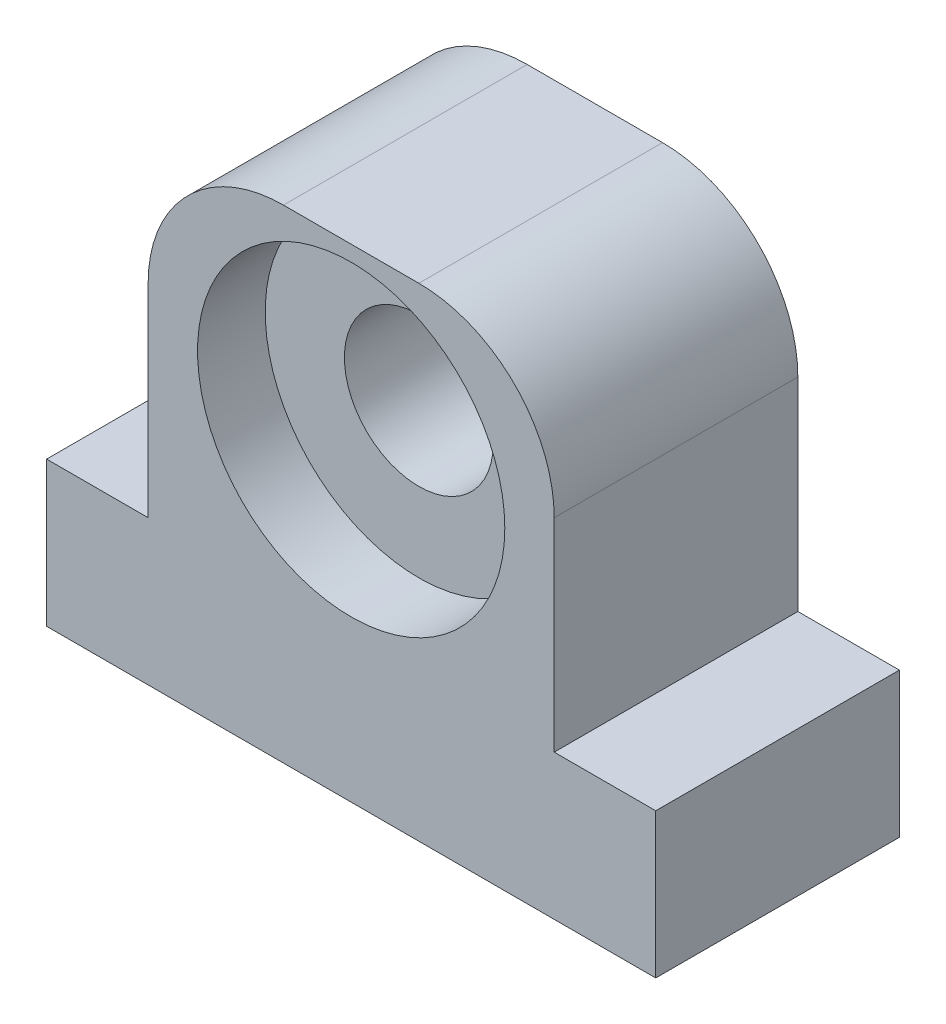
ISO-10303-21;
HEADER;
FILE_DESCRIPTION(('STEP AP214'),'2;1');
FILE_NAME('part.step','',(''),(''),'','','');
FILE_SCHEMA(('AUTOMOTIVE_DESIGN { 1 0 10303 214 1 1 1 1 }'));
ENDSEC;
DATA;
#1=APPLICATION_CONTEXT('core data for automotive mechanical design processes');
#2=APPLICATION_PROTOCOL_DEFINITION('international standard','automotive_design',2000,#1);
#3=PRODUCT_CONTEXT('',#1,'mechanical');
#4=PRODUCT('Part','Part','',(#3));
#5=PRODUCT_RELATED_PRODUCT_CATEGORY('part','',(#4));
#6=PRODUCT_DEFINITION_FORMATION('','',#4);
#7=PRODUCT_DEFINITION_CONTEXT('part definition',#1,'design');
#8=PRODUCT_DEFINITION('design','',#6,#7);
#9=PRODUCT_DEFINITION_SHAPE('','',#8);
#10=(LENGTH_UNIT() NAMED_UNIT(*) SI_UNIT(.MILLI.,.METRE.));
#11=(NAMED_UNIT(*) PLANE_ANGLE_UNIT() SI_UNIT($,.RADIAN.));
#12=(NAMED_UNIT(*) SI_UNIT($,.STERADIAN.) SOLID_ANGLE_UNIT());
#13=UNCERTAINTY_MEASURE_WITH_UNIT(LENGTH_MEASURE(1.E-05),#10,'distance_accuracy_value','');
#14=(GEOMETRIC_REPRESENTATION_CONTEXT(3) GLOBAL_UNCERTAINTY_ASSIGNED_CONTEXT((#13)) GLOBAL_UNIT_ASSIGNED_CONTEXT((#10,
#11,#12)) REPRESENTATION_CONTEXT('',''));
#15=CARTESIAN_POINT('',(0.,0.,0.));
#16=DIRECTION('',(0.,0.,1.));
#17=DIRECTION('',(1.,0.,0.));
#18=AXIS2_PLACEMENT_3D('',#15,#16,#17);
#19=CARTESIAN_POINT('',(0.,15.5,-16.));
#20=DIRECTION('',(0.,0.,1.));
#21=DIRECTION('',(1.,0.,0.));
#22=AXIS2_PLACEMENT_3D('',#19,#20,#21);
#23=CYLINDRICAL_SURFACE('',#22,5.5);
#24=CARTESIAN_POINT('',(0.,15.5,-9.));
#25=DIRECTION('',(0.,0.,1.));
#26=DIRECTION('',(1.,0.,0.));
#27=AXIS2_PLACEMENT_3D('',#24,#25,#26);
#28=CIRCLE('',#27,5.5);
#29=CARTESIAN_POINT('',(5.5,15.5,-9.));
#30=VERTEX_POINT('',#29);
#31=EDGE_CURVE('E160',#30,#30,#28,.T.);
#32=ORIENTED_EDGE('',*,*,#31,.F.);
#33=EDGE_LOOP('',(#32));
#34=FACE_BOUND('',#33,.T.);
#35=CARTESIAN_POINT('',(0.,15.5,4.));
#36=DIRECTION('',(0.,0.,1.));
#37=DIRECTION('',(1.,0.,0.));
#38=AXIS2_PLACEMENT_3D('',#35,#36,#37);
#39=CIRCLE('',#38,5.5);
#40=CARTESIAN_POINT('',(5.5,15.5,4.));
#41=VERTEX_POINT('',#40);
#42=EDGE_CURVE('E156',#41,#41,#39,.F.);
#43=ORIENTED_EDGE('',*,*,#42,.F.);
#44=EDGE_LOOP('',(#43));
#45=FACE_BOUND('',#44,.T.);
#46=ADVANCED_FACE('F39',(#34,#45),#23,.F.);
#47=CARTESIAN_POINT('',(0.,3.,0.));
#48=DIRECTION('',(0.,1.,0.));
#49=DIRECTION('',(0.,0.,1.));
#50=AXIS2_PLACEMENT_3D('',#47,#48,#49);
#51=PLANE('',#50);
#52=DIRECTION('',(0.,0.,-1.));
#53=VECTOR('',#52,1.);
#54=CARTESIAN_POINT('',(15.,3.,-9.));
#55=LINE('',#54,#53);
#56=CARTESIAN_POINT('',(15.,3.,9.));
#57=VERTEX_POINT('',#56);
#58=CARTESIAN_POINT('',(15.,3.,-9.));
#59=VERTEX_POINT('',#58);
#60=EDGE_CURVE('E164',#57,#59,#55,.T.);
#61=ORIENTED_EDGE('',*,*,#60,.F.);
#62=DIRECTION('',(1.,0.,0.));
#63=VECTOR('',#62,1.);
#64=CARTESIAN_POINT('',(-22.5,3.,9.));
#65=LINE('',#64,#63);
#66=CARTESIAN_POINT('',(22.5,3.,9.));
#67=VERTEX_POINT('',#66);
#68=EDGE_CURVE('E203',#57,#67,#65,.T.);
#69=ORIENTED_EDGE('',*,*,#68,.T.);
#70=DIRECTION('',(0.,0.,-1.));
#71=VECTOR('',#70,1.);
#72=CARTESIAN_POINT('',(22.5,3.,-9.));
#73=LINE('',#72,#71);
#74=CARTESIAN_POINT('',(22.5,3.,-9.));
#75=VERTEX_POINT('',#74);
#76=EDGE_CURVE('E192',#67,#75,#73,.T.);
#77=ORIENTED_EDGE('',*,*,#76,.T.);
#78=DIRECTION('',(-1.,0.,0.));
#79=VECTOR('',#78,1.);
#80=CARTESIAN_POINT('',(-22.5,3.,-9.));
#81=LINE('',#80,#79);
#82=EDGE_CURVE('E197',#75,#59,#81,.T.);
#83=ORIENTED_EDGE('',*,*,#82,.T.);
#84=EDGE_LOOP('',(#61,#69,#77,#83));
#85=FACE_BOUND('',#84,.T.);
#86=ADVANCED_FACE('F257',(#85),#51,.T.);
#87=CARTESIAN_POINT('',(22.5,3.,-9.));
#88=DIRECTION('',(-1.,0.,0.));
#89=DIRECTION('',(0.,0.,1.));
#90=AXIS2_PLACEMENT_3D('',#87,#88,#89);
#91=PLANE('',#90);
#92=DIRECTION('',(0.,-1.,0.));
#93=VECTOR('',#92,1.);
#94=CARTESIAN_POINT('',(22.5,3.,9.));
#95=LINE('',#94,#93);
#96=CARTESIAN_POINT('',(22.5,-7.7,9.));
#97=VERTEX_POINT('',#96);
#98=EDGE_CURVE('E208',#67,#97,#95,.T.);
#99=ORIENTED_EDGE('',*,*,#98,.T.);
#100=DIRECTION('',(0.,0.,1.));
#101=VECTOR('',#100,1.);
#102=CARTESIAN_POINT('',(22.5,-7.7,9.));
#103=LINE('',#102,#101);
#104=CARTESIAN_POINT('',(22.5,-7.7,-9.));
#105=VERTEX_POINT('',#104);
#106=EDGE_CURVE('E138',#105,#97,#103,.T.);
#107=ORIENTED_EDGE('',*,*,#106,.F.);
#108=DIRECTION('',(0.,-1.,0.));
#109=VECTOR('',#108,1.);
#110=CARTESIAN_POINT('',(22.5,3.,-9.));
#111=LINE('',#110,#109);
#112=EDGE_CURVE('E127',#75,#105,#111,.T.);
#113=ORIENTED_EDGE('',*,*,#112,.F.);
#114=ORIENTED_EDGE('',*,*,#76,.F.);
#115=EDGE_LOOP('',(#99,#107,#113,#114));
#116=FACE_BOUND('',#115,.T.);
#117=ADVANCED_FACE('F261',(#116),#91,.F.);
#118=CARTESIAN_POINT('',(-22.5,3.,-9.));
#119=DIRECTION('',(0.,0.,1.));
#120=DIRECTION('',(1.,0.,0.));
#121=AXIS2_PLACEMENT_3D('',#118,#119,#120);
#122=PLANE('',#121);
#123=ORIENTED_EDGE('',*,*,#31,.T.);
#124=EDGE_LOOP('',(#123));
#125=FACE_BOUND('',#124,.T.);
#126=DIRECTION('',(0.,-1.,0.));
#127=VECTOR('',#126,1.);
#128=CARTESIAN_POINT('',(-15.,28.,-9.));
#129=LINE('',#128,#127);
#130=CARTESIAN_POINT('',(-15.,18.,-9.));
#131=VERTEX_POINT('',#130);
#132=CARTESIAN_POINT('',(-15.,3.,-9.));
#133=VERTEX_POINT('',#132);
#134=EDGE_CURVE('E186',#131,#133,#129,.T.);
#135=ORIENTED_EDGE('',*,*,#134,.F.);
#136=CARTESIAN_POINT('',(-5.,18.,-9.));
#137=DIRECTION('',(0.,0.,1.));
#138=DIRECTION('',(1.,0.,0.));
#139=AXIS2_PLACEMENT_3D('',#136,#137,#138);
#140=CIRCLE('',#139,10.);
#141=CARTESIAN_POINT('',(-5.,28.,-9.));
#142=VERTEX_POINT('',#141);
#143=EDGE_CURVE('E48',#131,#142,#140,.F.);
#144=ORIENTED_EDGE('',*,*,#143,.T.);
#145=DIRECTION('',(-1.,0.,0.));
#146=VECTOR('',#145,1.);
#147=CARTESIAN_POINT('',(-15.,28.,-9.));
#148=LINE('',#147,#146);
#149=CARTESIAN_POINT('',(5.,28.,-9.));
#150=VERTEX_POINT('',#149);
#151=EDGE_CURVE('E165',#150,#142,#148,.T.);
#152=ORIENTED_EDGE('',*,*,#151,.F.);
#153=CARTESIAN_POINT('',(5.,18.,-9.));
#154=DIRECTION('',(0.,0.,1.));
#155=DIRECTION('',(1.,0.,0.));
#156=AXIS2_PLACEMENT_3D('',#153,#154,#155);
#157=CIRCLE('',#156,10.);
#158=CARTESIAN_POINT('',(15.,18.,-9.));
#159=VERTEX_POINT('',#158);
#160=EDGE_CURVE('E55',#150,#159,#157,.F.);
#161=ORIENTED_EDGE('',*,*,#160,.T.);
#162=DIRECTION('',(0.,-1.,0.));
#163=VECTOR('',#162,1.);
#164=CARTESIAN_POINT('',(15.,28.,-9.));
#165=LINE('',#164,#163);
#166=EDGE_CURVE('E189',#159,#59,#165,.T.);
#167=ORIENTED_EDGE('',*,*,#166,.T.);
#168=ORIENTED_EDGE('',*,*,#82,.F.);
#169=ORIENTED_EDGE('',*,*,#112,.T.);
#170=DIRECTION('',(1.,0.,0.));
#171=VECTOR('',#170,1.);
#172=CARTESIAN_POINT('',(-22.5,-7.7,-9.));
#173=LINE('',#172,#171);
#174=CARTESIAN_POINT('',(-22.5,-7.7,-9.));
#175=VERTEX_POINT('',#174);
#176=EDGE_CURVE('E131',#175,#105,#173,.T.);
#177=ORIENTED_EDGE('',*,*,#176,.F.);
#178=DIRECTION('',(0.,-1.,0.));
#179=VECTOR('',#178,1.);
#180=CARTESIAN_POINT('',(-22.5,3.,-9.));
#181=LINE('',#180,#179);
#182=CARTESIAN_POINT('',(-22.5,3.,-9.));
#183=VERTEX_POINT('',#182);
#184=EDGE_CURVE('E118',#183,#175,#181,.T.);
#185=ORIENTED_EDGE('',*,*,#184,.F.);
#186=EDGE_CURVE('E196',#133,#183,#81,.T.);
#187=ORIENTED_EDGE('',*,*,#186,.F.);
#188=EDGE_LOOP('',(#135,#144,#152,#161,#167,#168,#169,#177,#185,#187));
#189=FACE_BOUND('',#188,.T.);
#190=ADVANCED_FACE('F132',(#125,#189),#122,.F.);
#191=CARTESIAN_POINT('',(-22.5,3.,-9.));
#192=DIRECTION('',(1.,0.,0.));
#193=DIRECTION('',(0.,0.,-1.));
#194=AXIS2_PLACEMENT_3D('',#191,#192,#193);
#195=PLANE('',#194);
#196=ORIENTED_EDGE('',*,*,#184,.T.);
#197=DIRECTION('',(0.,0.,-1.));
#198=VECTOR('',#197,1.);
#199=CARTESIAN_POINT('',(-22.5,-7.7,9.));
#200=LINE('',#199,#198);
#201=CARTESIAN_POINT('',(-22.5,-7.7,9.));
#202=VERTEX_POINT('',#201);
#203=EDGE_CURVE('E123',#202,#175,#200,.T.);
#204=ORIENTED_EDGE('',*,*,#203,.F.);
#205=DIRECTION('',(0.,-1.,0.));
#206=VECTOR('',#205,1.);
#207=CARTESIAN_POINT('',(-22.5,3.,9.));
#208=LINE('',#207,#206);
#209=CARTESIAN_POINT('',(-22.5,3.,9.));
#210=VERTEX_POINT('',#209);
#211=EDGE_CURVE('E128',#210,#202,#208,.T.);
#212=ORIENTED_EDGE('',*,*,#211,.F.);
#213=DIRECTION('',(0.,0.,1.));
#214=VECTOR('',#213,1.);
#215=CARTESIAN_POINT('',(-22.5,3.,-9.));
#216=LINE('',#215,#214);
#217=EDGE_CURVE('E124',#183,#210,#216,.T.);
#218=ORIENTED_EDGE('',*,*,#217,.F.);
#219=EDGE_LOOP('',(#196,#204,#212,#218));
#220=FACE_BOUND('',#219,.T.);
#221=ADVANCED_FACE('F120',(#220),#195,.F.);
#222=CARTESIAN_POINT('',(-22.5,3.,9.));
#223=DIRECTION('',(0.,0.,-1.));
#224=DIRECTION('',(-1.,0.,0.));
#225=AXIS2_PLACEMENT_3D('',#222,#223,#224);
#226=PLANE('',#225);
#227=CARTESIAN_POINT('',(0.,15.5,9.));
#228=DIRECTION('',(0.,0.,1.));
#229=DIRECTION('',(1.,0.,0.));
#230=AXIS2_PLACEMENT_3D('',#227,#228,#229);
#231=CIRCLE('',#230,11.35);
#232=CARTESIAN_POINT('',(11.35,15.5,9.));
#233=VERTEX_POINT('',#232);
#234=EDGE_CURVE('E151',#233,#233,#231,.T.);
#235=ORIENTED_EDGE('',*,*,#234,.F.);
#236=EDGE_LOOP('',(#235));
#237=FACE_BOUND('',#236,.T.);
#238=DIRECTION('',(1.,0.,0.));
#239=VECTOR('',#238,1.);
#240=CARTESIAN_POINT('',(-15.,28.,9.));
#241=LINE('',#240,#239);
#242=CARTESIAN_POINT('',(-5.,28.,9.));
#243=VERTEX_POINT('',#242);
#244=CARTESIAN_POINT('',(5.,28.,9.));
#245=VERTEX_POINT('',#244);
#246=EDGE_CURVE('E169',#243,#245,#241,.T.);
#247=ORIENTED_EDGE('',*,*,#246,.F.);
#248=CARTESIAN_POINT('',(-5.,18.,9.));
#249=DIRECTION('',(0.,0.,-1.));
#250=DIRECTION('',(-1.,0.,0.));
#251=AXIS2_PLACEMENT_3D('',#248,#249,#250);
#252=CIRCLE('',#251,10.);
#253=CARTESIAN_POINT('',(-15.,18.,9.));
#254=VERTEX_POINT('',#253);
#255=EDGE_CURVE('E229',#243,#254,#252,.F.);
#256=ORIENTED_EDGE('',*,*,#255,.T.);
#257=DIRECTION('',(0.,-1.,0.));
#258=VECTOR('',#257,1.);
#259=CARTESIAN_POINT('',(-15.,28.,9.));
#260=LINE('',#259,#258);
#261=CARTESIAN_POINT('',(-15.,3.,9.));
#262=VERTEX_POINT('',#261);
#263=EDGE_CURVE('E183',#254,#262,#260,.T.);
#264=ORIENTED_EDGE('',*,*,#263,.T.);
#265=EDGE_CURVE('E204',#210,#262,#65,.T.);
#266=ORIENTED_EDGE('',*,*,#265,.F.);
#267=ORIENTED_EDGE('',*,*,#211,.T.);
#268=DIRECTION('',(-1.,0.,0.));
#269=VECTOR('',#268,1.);
#270=CARTESIAN_POINT('',(-22.5,-7.7,9.));
#271=LINE('',#270,#269);
#272=EDGE_CURVE('E143',#97,#202,#271,.T.);
#273=ORIENTED_EDGE('',*,*,#272,.F.);
#274=ORIENTED_EDGE('',*,*,#98,.F.);
#275=ORIENTED_EDGE('',*,*,#68,.F.);
#276=DIRECTION('',(0.,-1.,0.));
#277=VECTOR('',#276,1.);
#278=CARTESIAN_POINT('',(15.,28.,9.));
#279=LINE('',#278,#277);
#280=CARTESIAN_POINT('',(15.,18.,9.));
#281=VERTEX_POINT('',#280);
#282=EDGE_CURVE('E174',#281,#57,#279,.T.);
#283=ORIENTED_EDGE('',*,*,#282,.F.);
#284=CARTESIAN_POINT('',(5.,18.,9.));
#285=DIRECTION('',(0.,0.,-1.));
#286=DIRECTION('',(-1.,0.,0.));
#287=AXIS2_PLACEMENT_3D('',#284,#285,#286);
#288=CIRCLE('',#287,10.);
#289=EDGE_CURVE('E226',#281,#245,#288,.F.);
#290=ORIENTED_EDGE('',*,*,#289,.T.);
#291=EDGE_LOOP('',(#247,#256,#264,#266,#267,#273,#274,#275,#283,#290));
#292=FACE_BOUND('',#291,.T.);
#293=ADVANCED_FACE('F245',(#237,#292),#226,.F.);
#294=DIRECTION('',(0.,0.,1.));
#295=VECTOR('',#294,1.);
#296=CARTESIAN_POINT('',(-15.,3.,-9.));
#297=LINE('',#296,#295);
#298=EDGE_CURVE('E170',#133,#262,#297,.T.);
#299=ORIENTED_EDGE('',*,*,#298,.F.);
#300=ORIENTED_EDGE('',*,*,#186,.T.);
#301=ORIENTED_EDGE('',*,*,#217,.T.);
#302=ORIENTED_EDGE('',*,*,#265,.T.);
#303=EDGE_LOOP('',(#299,#300,#301,#302));
#304=FACE_BOUND('',#303,.T.);
#305=ADVANCED_FACE('F250',(#304),#51,.T.);
#306=CARTESIAN_POINT('',(15.,28.,-9.));
#307=DIRECTION('',(-1.,0.,0.));
#308=DIRECTION('',(0.,0.,1.));
#309=AXIS2_PLACEMENT_3D('',#306,#307,#308);
#310=PLANE('',#309);
#311=ORIENTED_EDGE('',*,*,#166,.F.);
#312=DIRECTION('',(0.,0.,-1.));
#313=VECTOR('',#312,1.);
#314=CARTESIAN_POINT('',(15.,18.,9.));
#315=LINE('',#314,#313);
#316=EDGE_CURVE('E11',#159,#281,#315,.F.);
#317=ORIENTED_EDGE('',*,*,#316,.T.);
#318=ORIENTED_EDGE('',*,*,#282,.T.);
#319=ORIENTED_EDGE('',*,*,#60,.T.);
#320=EDGE_LOOP('',(#311,#317,#318,#319));
#321=FACE_BOUND('',#320,.T.);
#322=ADVANCED_FACE('F287',(#321),#310,.F.);
#323=CARTESIAN_POINT('',(-15.,28.,-9.));
#324=DIRECTION('',(1.,0.,0.));
#325=DIRECTION('',(0.,0.,-1.));
#326=AXIS2_PLACEMENT_3D('',#323,#324,#325);
#327=PLANE('',#326);
#328=ORIENTED_EDGE('',*,*,#263,.F.);
#329=DIRECTION('',(0.,0.,1.));
#330=VECTOR('',#329,1.);
#331=CARTESIAN_POINT('',(-15.,18.,-9.));
#332=LINE('',#331,#330);
#333=EDGE_CURVE('E63',#254,#131,#332,.F.);
#334=ORIENTED_EDGE('',*,*,#333,.T.);
#335=ORIENTED_EDGE('',*,*,#134,.T.);
#336=ORIENTED_EDGE('',*,*,#298,.T.);
#337=EDGE_LOOP('',(#328,#334,#335,#336));
#338=FACE_BOUND('',#337,.T.);
#339=ADVANCED_FACE('F247',(#338),#327,.F.);
#340=CARTESIAN_POINT('',(0.,28.,0.));
#341=DIRECTION('',(0.,1.,0.));
#342=DIRECTION('',(0.,0.,1.));
#343=AXIS2_PLACEMENT_3D('',#340,#341,#342);
#344=PLANE('',#343);
#345=ORIENTED_EDGE('',*,*,#151,.T.);
#346=DIRECTION('',(0.,0.,1.));
#347=VECTOR('',#346,1.);
#348=CARTESIAN_POINT('',(-5.,28.,9.));
#349=LINE('',#348,#347);
#350=EDGE_CURVE('E222',#142,#243,#349,.T.);
#351=ORIENTED_EDGE('',*,*,#350,.T.);
#352=ORIENTED_EDGE('',*,*,#246,.T.);
#353=DIRECTION('',(0.,0.,-1.));
#354=VECTOR('',#353,1.);
#355=CARTESIAN_POINT('',(5.,28.,-9.));
#356=LINE('',#355,#354);
#357=EDGE_CURVE('E215',#245,#150,#356,.T.);
#358=ORIENTED_EDGE('',*,*,#357,.T.);
#359=EDGE_LOOP('',(#345,#351,#352,#358));
#360=FACE_BOUND('',#359,.T.);
#361=ADVANCED_FACE('F240',(#360),#344,.T.);
#362=CARTESIAN_POINT('',(0.,15.5,4.));
#363=DIRECTION('',(0.,0.,1.));
#364=DIRECTION('',(1.,0.,0.));
#365=AXIS2_PLACEMENT_3D('',#362,#363,#364);
#366=PLANE('',#365);
#367=CARTESIAN_POINT('',(0.,15.5,4.));
#368=DIRECTION('',(0.,0.,1.));
#369=DIRECTION('',(1.,0.,0.));
#370=AXIS2_PLACEMENT_3D('',#367,#368,#369);
#371=CIRCLE('',#370,11.35);
#372=CARTESIAN_POINT('',(11.35,15.5,4.));
#373=VERTEX_POINT('',#372);
#374=EDGE_CURVE('E152',#373,#373,#371,.T.);
#375=ORIENTED_EDGE('',*,*,#374,.T.);
#376=EDGE_LOOP('',(#375));
#377=FACE_BOUND('',#376,.T.);
#378=ORIENTED_EDGE('',*,*,#42,.T.);
#379=EDGE_LOOP('',(#378));
#380=FACE_BOUND('',#379,.T.);
#381=ADVANCED_FACE('F284',(#377,#380),#366,.T.);
#382=CARTESIAN_POINT('',(0.,15.5,4.));
#383=DIRECTION('',(0.,0.,1.));
#384=DIRECTION('',(1.,0.,0.));
#385=AXIS2_PLACEMENT_3D('',#382,#383,#384);
#386=CYLINDRICAL_SURFACE('',#385,11.35);
#387=ORIENTED_EDGE('',*,*,#374,.F.);
#388=EDGE_LOOP('',(#387));
#389=FACE_BOUND('',#388,.T.);
#390=ORIENTED_EDGE('',*,*,#234,.T.);
#391=EDGE_LOOP('',(#390));
#392=FACE_BOUND('',#391,.T.);
#393=ADVANCED_FACE('F280',(#389,#392),#386,.F.);
#394=CARTESIAN_POINT('',(-5.,18.,0.));
#395=DIRECTION('',(0.,0.,-1.));
#396=DIRECTION('',(-1.,0.,0.));
#397=AXIS2_PLACEMENT_3D('',#394,#395,#396);
#398=CYLINDRICAL_SURFACE('',#397,10.);
#399=ORIENTED_EDGE('',*,*,#143,.F.);
#400=ORIENTED_EDGE('',*,*,#333,.F.);
#401=ORIENTED_EDGE('',*,*,#255,.F.);
#402=ORIENTED_EDGE('',*,*,#350,.F.);
#403=EDGE_LOOP('',(#399,#400,#401,#402));
#404=FACE_BOUND('',#403,.T.);
#405=ADVANCED_FACE('F243',(#404),#398,.T.);
#406=CARTESIAN_POINT('',(5.,18.,0.));
#407=DIRECTION('',(0.,0.,1.));
#408=DIRECTION('',(1.,0.,0.));
#409=AXIS2_PLACEMENT_3D('',#406,#407,#408);
#410=CYLINDRICAL_SURFACE('',#409,10.);
#411=ORIENTED_EDGE('',*,*,#289,.F.);
#412=ORIENTED_EDGE('',*,*,#316,.F.);
#413=ORIENTED_EDGE('',*,*,#160,.F.);
#414=ORIENTED_EDGE('',*,*,#357,.F.);
#415=EDGE_LOOP('',(#411,#412,#413,#414));
#416=FACE_BOUND('',#415,.T.);
#417=ADVANCED_FACE('F41',(#416),#410,.T.);
#418=CARTESIAN_POINT('',(0.,-7.7,0.));
#419=DIRECTION('',(0.,-1.,0.));
#420=DIRECTION('',(0.,0.,-1.));
#421=AXIS2_PLACEMENT_3D('',#418,#419,#420);
#422=PLANE('',#421);
#423=ORIENTED_EDGE('',*,*,#203,.T.);
#424=ORIENTED_EDGE('',*,*,#176,.T.);
#425=ORIENTED_EDGE('',*,*,#106,.T.);
#426=ORIENTED_EDGE('',*,*,#272,.T.);
#427=EDGE_LOOP('',(#423,#424,#425,#426));
#428=FACE_BOUND('',#427,.T.);
#429=ADVANCED_FACE('F141',(#428),#422,.T.);
#430=CLOSED_SHELL('',(#46,#86,#117,#190,#221,#293,#305,#322,#339,#361,#381,#393,#405,#417,#429));
#431=MANIFOLD_SOLID_BREP('B2',#430);
#432=ADVANCED_BREP_SHAPE_REPRESENTATION('',(#18,#431),#14);
#433=SHAPE_DEFINITION_REPRESENTATION(#9,#432);
ENDSEC;
END-ISO-10303-21;
